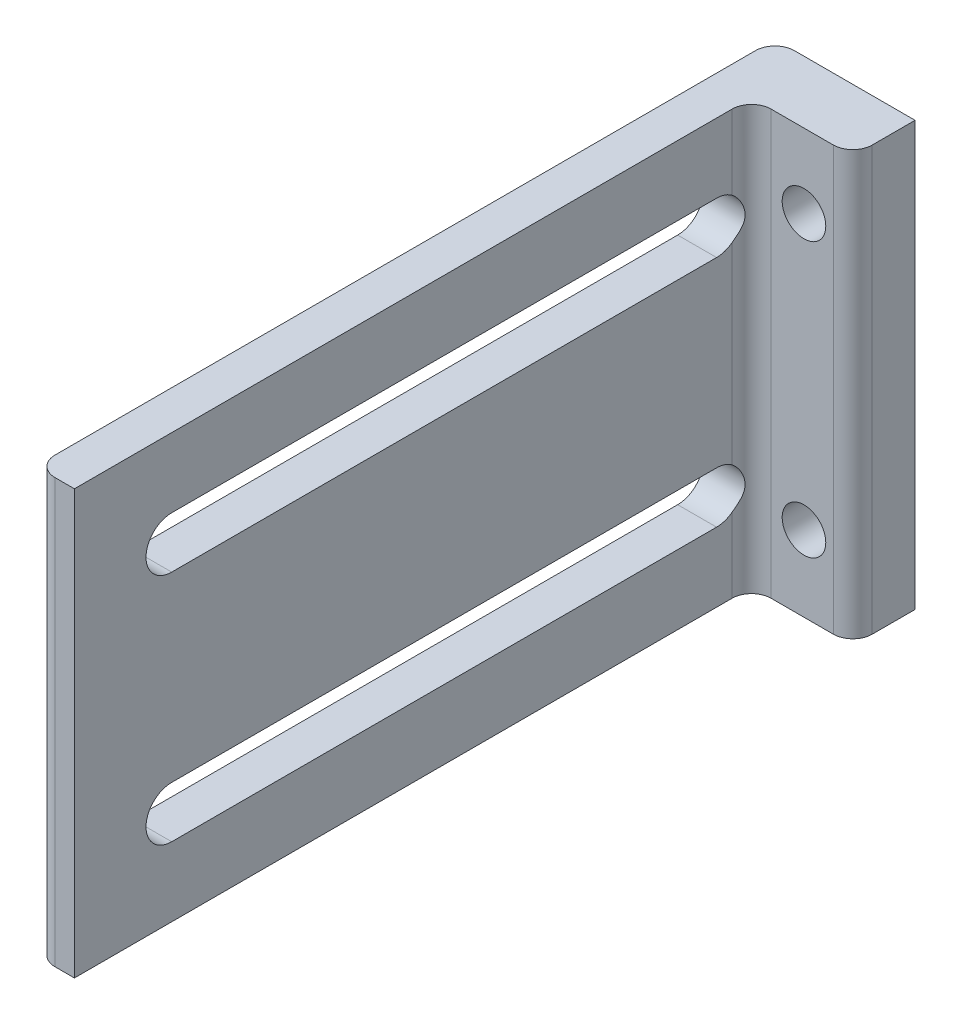
ISO-10303-21;
HEADER;
FILE_DESCRIPTION(('STEP AP214'),'2;1');
FILE_NAME('part.step','',(''),(''),'','','');
FILE_SCHEMA(('AUTOMOTIVE_DESIGN { 1 0 10303 214 1 1 1 1 }'));
ENDSEC;
DATA;
#1=APPLICATION_CONTEXT('core data for automotive mechanical design processes');
#2=APPLICATION_PROTOCOL_DEFINITION('international standard','automotive_design',2000,#1);
#3=PRODUCT_CONTEXT('',#1,'mechanical');
#4=PRODUCT('Part','Part','',(#3));
#5=PRODUCT_RELATED_PRODUCT_CATEGORY('part','',(#4));
#6=PRODUCT_DEFINITION_FORMATION('','',#4);
#7=PRODUCT_DEFINITION_CONTEXT('part definition',#1,'design');
#8=PRODUCT_DEFINITION('design','',#6,#7);
#9=PRODUCT_DEFINITION_SHAPE('','',#8);
#10=(LENGTH_UNIT() NAMED_UNIT(*) SI_UNIT(.MILLI.,.METRE.));
#11=(NAMED_UNIT(*) PLANE_ANGLE_UNIT() SI_UNIT($,.RADIAN.));
#12=(NAMED_UNIT(*) SI_UNIT($,.STERADIAN.) SOLID_ANGLE_UNIT());
#13=UNCERTAINTY_MEASURE_WITH_UNIT(LENGTH_MEASURE(1.E-05),#10,'distance_accuracy_value','');
#14=(GEOMETRIC_REPRESENTATION_CONTEXT(3) GLOBAL_UNCERTAINTY_ASSIGNED_CONTEXT((#13)) GLOBAL_UNIT_ASSIGNED_CONTEXT((#10,
#11,#12)) REPRESENTATION_CONTEXT('',''));
#15=CARTESIAN_POINT('',(0.,0.,0.));
#16=DIRECTION('',(0.,0.,1.));
#17=DIRECTION('',(1.,0.,0.));
#18=AXIS2_PLACEMENT_3D('',#15,#16,#17);
#19=CARTESIAN_POINT('',(-44.365,-28.1052986336546,4.));
#20=DIRECTION('',(-1.,0.,0.));
#21=DIRECTION('',(0.,-1.,0.));
#22=AXIS2_PLACEMENT_3D('',#19,#20,#21);
#23=PLANE('',#22);
#24=DIRECTION('',(0.,0.,-1.));
#25=VECTOR('',#24,1.);
#26=CARTESIAN_POINT('',(-44.365,-0.889999999999988,4.));
#27=LINE('',#26,#25);
#28=CARTESIAN_POINT('',(-44.365,-0.889999999999988,2.75));
#29=VERTEX_POINT('',#28);
#30=CARTESIAN_POINT('',(-44.365,-0.889999999999988,0.));
#31=VERTEX_POINT('',#30);
#32=EDGE_CURVE('E355',#29,#31,#27,.T.);
#33=ORIENTED_EDGE('',*,*,#32,.F.);
#34=DIRECTION('',(0.,1.,0.));
#35=VECTOR('',#34,1.);
#36=CARTESIAN_POINT('',(-44.365,-28.1052986336546,2.75));
#37=LINE('',#36,#35);
#38=CARTESIAN_POINT('',(-44.365,-28.1052986336546,2.75));
#39=VERTEX_POINT('',#38);
#40=EDGE_CURVE('E278',#29,#39,#37,.F.);
#41=ORIENTED_EDGE('',*,*,#40,.T.);
#42=DIRECTION('',(0.,0.,-1.));
#43=VECTOR('',#42,1.);
#44=CARTESIAN_POINT('',(-44.365,-28.1052986336546,4.));
#45=LINE('',#44,#43);
#46=CARTESIAN_POINT('',(-44.365,-28.1052986336546,0.));
#47=VERTEX_POINT('',#46);
#48=EDGE_CURVE('E344',#39,#47,#45,.T.);
#49=ORIENTED_EDGE('',*,*,#48,.T.);
#50=DIRECTION('',(0.,1.,0.));
#51=VECTOR('',#50,1.);
#52=CARTESIAN_POINT('',(-44.365,-28.1052986336546,0.));
#53=LINE('',#52,#51);
#54=EDGE_CURVE('E335',#47,#31,#53,.T.);
#55=ORIENTED_EDGE('',*,*,#54,.T.);
#56=EDGE_LOOP('',(#33,#41,#49,#55));
#57=FACE_BOUND('',#56,.T.);
#58=ADVANCED_FACE('F33',(#57),#23,.F.);
#59=CARTESIAN_POINT('',(-44.365,-0.889999999999988,4.));
#60=DIRECTION('',(0.,-1.,0.));
#61=DIRECTION('',(1.,0.,0.));
#62=AXIS2_PLACEMENT_3D('',#59,#60,#61);
#63=PLANE('',#62);
#64=DIRECTION('',(-1.,0.,0.));
#65=VECTOR('',#64,1.);
#66=CARTESIAN_POINT('',(-44.365,-0.889999999999988,0.));
#67=LINE('',#66,#65);
#68=CARTESIAN_POINT('',(-52.115,-0.889999999999989,0.));
#69=VERTEX_POINT('',#68);
#70=EDGE_CURVE('E338',#31,#69,#67,.T.);
#71=ORIENTED_EDGE('',*,*,#70,.T.);
#72=CARTESIAN_POINT('',(-52.115,-0.889999999999988,1.25));
#73=DIRECTION('',(0.,-1.,0.));
#74=DIRECTION('',(1.,0.,0.));
#75=AXIS2_PLACEMENT_3D('',#72,#73,#74);
#76=CIRCLE('',#75,1.25);
#77=CARTESIAN_POINT('',(-53.365,-0.889999999999989,1.25));
#78=VERTEX_POINT('',#77);
#79=EDGE_CURVE('E299',#69,#78,#76,.F.);
#80=ORIENTED_EDGE('',*,*,#79,.T.);
#81=DIRECTION('',(0.,0.,-1.));
#82=VECTOR('',#81,1.);
#83=CARTESIAN_POINT('',(-53.365,-0.889999999999989,4.));
#84=LINE('',#83,#82);
#85=CARTESIAN_POINT('',(-53.365,-0.889999999999989,46.25));
#86=VERTEX_POINT('',#85);
#87=EDGE_CURVE('E352',#86,#78,#84,.T.);
#88=ORIENTED_EDGE('',*,*,#87,.F.);
#89=CARTESIAN_POINT('',(-52.115,-0.889999999999989,46.25));
#90=DIRECTION('',(0.,-1.,0.));
#91=DIRECTION('',(1.,0.,0.));
#92=AXIS2_PLACEMENT_3D('',#89,#90,#91);
#93=CIRCLE('',#92,1.25);
#94=CARTESIAN_POINT('',(-52.115,-0.889999999999988,47.5));
#95=VERTEX_POINT('',#94);
#96=EDGE_CURVE('E295',#86,#95,#93,.F.);
#97=ORIENTED_EDGE('',*,*,#96,.T.);
#98=DIRECTION('',(-1.,0.,0.));
#99=VECTOR('',#98,1.);
#100=CARTESIAN_POINT('',(-53.365,-0.889999999999988,47.5));
#101=LINE('',#100,#99);
#102=CARTESIAN_POINT('',(-50.865,-0.889999999999988,47.5));
#103=VERTEX_POINT('',#102);
#104=EDGE_CURVE('E340',#103,#95,#101,.T.);
#105=ORIENTED_EDGE('',*,*,#104,.F.);
#106=DIRECTION('',(0.,0.,-1.));
#107=VECTOR('',#106,1.);
#108=CARTESIAN_POINT('',(-50.865,-0.889999999999988,47.5));
#109=LINE('',#108,#107);
#110=CARTESIAN_POINT('',(-50.865,-0.889999999999988,5.25));
#111=VERTEX_POINT('',#110);
#112=EDGE_CURVE('E318',#103,#111,#109,.T.);
#113=ORIENTED_EDGE('',*,*,#112,.T.);
#114=CARTESIAN_POINT('',(-49.615,-0.889999999999988,5.25));
#115=DIRECTION('',(0.,-1.,0.));
#116=DIRECTION('',(1.,0.,0.));
#117=AXIS2_PLACEMENT_3D('',#114,#115,#116);
#118=CIRCLE('',#117,1.25);
#119=CARTESIAN_POINT('',(-49.615,-0.889999999999989,4.));
#120=VERTEX_POINT('',#119);
#121=EDGE_CURVE('E41',#111,#120,#118,.T.);
#122=ORIENTED_EDGE('',*,*,#121,.T.);
#123=DIRECTION('',(-1.,0.,0.));
#124=VECTOR('',#123,1.);
#125=CARTESIAN_POINT('',(-44.365,-0.889999999999988,4.));
#126=LINE('',#125,#124);
#127=CARTESIAN_POINT('',(-45.615,-0.889999999999988,4.));
#128=VERTEX_POINT('',#127);
#129=EDGE_CURVE('E315',#128,#120,#126,.T.);
#130=ORIENTED_EDGE('',*,*,#129,.F.);
#131=CARTESIAN_POINT('',(-45.615,-0.889999999999988,2.75));
#132=DIRECTION('',(0.,-1.,0.));
#133=DIRECTION('',(1.,0.,0.));
#134=AXIS2_PLACEMENT_3D('',#131,#132,#133);
#135=CIRCLE('',#134,1.25);
#136=EDGE_CURVE('E297',#128,#29,#135,.F.);
#137=ORIENTED_EDGE('',*,*,#136,.T.);
#138=ORIENTED_EDGE('',*,*,#32,.T.);
#139=EDGE_LOOP('',(#71,#80,#88,#97,#105,#113,#122,#130,#137,#138));
#140=FACE_BOUND('',#139,.T.);
#141=ADVANCED_FACE('F246',(#140),#63,.F.);
#142=CARTESIAN_POINT('',(-53.365,-28.1052986336546,4.));
#143=DIRECTION('',(1.,0.,0.));
#144=DIRECTION('',(0.,1.,0.));
#145=AXIS2_PLACEMENT_3D('',#142,#143,#144);
#146=PLANE('',#145);
#147=DIRECTION('',(0.,0.,1.));
#148=VECTOR('',#147,1.);
#149=CARTESIAN_POINT('',(-53.365,-23.65,6.25));
#150=LINE('',#149,#148);
#151=CARTESIAN_POINT('',(-53.365,-23.65,6.25));
#152=VERTEX_POINT('',#151);
#153=CARTESIAN_POINT('',(-53.365,-23.65,41.25));
#154=VERTEX_POINT('',#153);
#155=EDGE_CURVE('E203',#152,#154,#150,.T.);
#156=ORIENTED_EDGE('',*,*,#155,.F.);
#157=CARTESIAN_POINT('',(-53.365,-22.,6.25));
#158=DIRECTION('',(-1.,0.,0.));
#159=DIRECTION('',(0.,-1.,0.));
#160=AXIS2_PLACEMENT_3D('',#157,#158,#159);
#161=CIRCLE('',#160,1.65);
#162=CARTESIAN_POINT('',(-53.365,-20.35,6.25));
#163=VERTEX_POINT('',#162);
#164=EDGE_CURVE('E48',#163,#152,#161,.T.);
#165=ORIENTED_EDGE('',*,*,#164,.F.);
#166=DIRECTION('',(0.,0.,-1.));
#167=VECTOR('',#166,1.);
#168=CARTESIAN_POINT('',(-53.365,-20.35,6.25));
#169=LINE('',#168,#167);
#170=CARTESIAN_POINT('',(-53.365,-20.35,41.25));
#171=VERTEX_POINT('',#170);
#172=EDGE_CURVE('E177',#171,#163,#169,.T.);
#173=ORIENTED_EDGE('',*,*,#172,.F.);
#174=CARTESIAN_POINT('',(-53.365,-22.,41.25));
#175=DIRECTION('',(-1.,0.,0.));
#176=DIRECTION('',(0.,-1.,0.));
#177=AXIS2_PLACEMENT_3D('',#174,#175,#176);
#178=CIRCLE('',#177,1.65);
#179=EDGE_CURVE('E205',#154,#171,#178,.T.);
#180=ORIENTED_EDGE('',*,*,#179,.F.);
#181=EDGE_LOOP('',(#156,#165,#173,#180));
#182=FACE_BOUND('',#181,.T.);
#183=DIRECTION('',(0.,0.,1.));
#184=VECTOR('',#183,1.);
#185=CARTESIAN_POINT('',(-53.365,-8.64999999999999,6.25));
#186=LINE('',#185,#184);
#187=CARTESIAN_POINT('',(-53.365,-8.64999999999999,6.25));
#188=VERTEX_POINT('',#187);
#189=CARTESIAN_POINT('',(-53.365,-8.64999999999999,41.25));
#190=VERTEX_POINT('',#189);
#191=EDGE_CURVE('E421',#188,#190,#186,.T.);
#192=ORIENTED_EDGE('',*,*,#191,.F.);
#193=CARTESIAN_POINT('',(-53.365,-6.99999999999999,6.25));
#194=DIRECTION('',(-1.,0.,0.));
#195=DIRECTION('',(0.,-1.,0.));
#196=AXIS2_PLACEMENT_3D('',#193,#194,#195);
#197=CIRCLE('',#196,1.65);
#198=CARTESIAN_POINT('',(-53.365,-5.34999999999999,6.25));
#199=VERTEX_POINT('',#198);
#200=EDGE_CURVE('E56',#199,#188,#197,.T.);
#201=ORIENTED_EDGE('',*,*,#200,.F.);
#202=DIRECTION('',(0.,0.,-1.));
#203=VECTOR('',#202,1.);
#204=CARTESIAN_POINT('',(-53.365,-5.34999999999999,6.25));
#205=LINE('',#204,#203);
#206=CARTESIAN_POINT('',(-53.365,-5.34999999999999,41.25));
#207=VERTEX_POINT('',#206);
#208=EDGE_CURVE('E426',#207,#199,#205,.T.);
#209=ORIENTED_EDGE('',*,*,#208,.F.);
#210=CARTESIAN_POINT('',(-53.365,-6.99999999999999,41.25));
#211=DIRECTION('',(-1.,0.,0.));
#212=DIRECTION('',(0.,-1.,0.));
#213=AXIS2_PLACEMENT_3D('',#210,#211,#212);
#214=CIRCLE('',#213,1.65);
#215=EDGE_CURVE('E423',#190,#207,#214,.T.);
#216=ORIENTED_EDGE('',*,*,#215,.F.);
#217=EDGE_LOOP('',(#192,#201,#209,#216));
#218=FACE_BOUND('',#217,.T.);
#219=ORIENTED_EDGE('',*,*,#87,.T.);
#220=DIRECTION('',(0.,-1.,0.));
#221=VECTOR('',#220,1.);
#222=CARTESIAN_POINT('',(-53.365,-28.1052986336546,1.25));
#223=LINE('',#222,#221);
#224=CARTESIAN_POINT('',(-53.365,-28.1052986336546,1.25));
#225=VERTEX_POINT('',#224);
#226=EDGE_CURVE('E290',#78,#225,#223,.T.);
#227=ORIENTED_EDGE('',*,*,#226,.T.);
#228=DIRECTION('',(0.,0.,-1.));
#229=VECTOR('',#228,1.);
#230=CARTESIAN_POINT('',(-53.365,-28.1052986336546,4.));
#231=LINE('',#230,#229);
#232=CARTESIAN_POINT('',(-53.365,-28.1052986336546,46.25));
#233=VERTEX_POINT('',#232);
#234=EDGE_CURVE('E350',#233,#225,#231,.T.);
#235=ORIENTED_EDGE('',*,*,#234,.F.);
#236=DIRECTION('',(0.,-1.,0.));
#237=VECTOR('',#236,1.);
#238=CARTESIAN_POINT('',(-53.365,-28.1052986336546,46.25));
#239=LINE('',#238,#237);
#240=EDGE_CURVE('E357',#233,#86,#239,.F.);
#241=ORIENTED_EDGE('',*,*,#240,.T.);
#242=EDGE_LOOP('',(#219,#227,#235,#241));
#243=FACE_BOUND('',#242,.T.);
#244=ADVANCED_FACE('F252',(#182,#218,#243),#146,.F.);
#245=CARTESIAN_POINT('',(-44.365,-28.1052986336546,4.));
#246=DIRECTION('',(0.,1.,0.));
#247=DIRECTION('',(0.,0.,1.));
#248=AXIS2_PLACEMENT_3D('',#245,#246,#247);
#249=PLANE('',#248);
#250=ORIENTED_EDGE('',*,*,#234,.T.);
#251=CARTESIAN_POINT('',(-52.115,-28.1052986336546,1.25));
#252=DIRECTION('',(0.,1.,0.));
#253=DIRECTION('',(0.,0.,1.));
#254=AXIS2_PLACEMENT_3D('',#251,#252,#253);
#255=CIRCLE('',#254,1.25);
#256=CARTESIAN_POINT('',(-52.115,-28.1052986336546,0.));
#257=VERTEX_POINT('',#256);
#258=EDGE_CURVE('E285',#225,#257,#255,.F.);
#259=ORIENTED_EDGE('',*,*,#258,.T.);
#260=DIRECTION('',(1.,0.,0.));
#261=VECTOR('',#260,1.);
#262=CARTESIAN_POINT('',(-44.365,-28.1052986336546,0.));
#263=LINE('',#262,#261);
#264=EDGE_CURVE('E324',#257,#47,#263,.T.);
#265=ORIENTED_EDGE('',*,*,#264,.T.);
#266=ORIENTED_EDGE('',*,*,#48,.F.);
#267=CARTESIAN_POINT('',(-45.615,-28.1052986336546,2.75));
#268=DIRECTION('',(0.,1.,0.));
#269=DIRECTION('',(0.,0.,1.));
#270=AXIS2_PLACEMENT_3D('',#267,#268,#269);
#271=CIRCLE('',#270,1.25);
#272=CARTESIAN_POINT('',(-45.615,-28.1052986336546,4.));
#273=VERTEX_POINT('',#272);
#274=EDGE_CURVE('E277',#39,#273,#271,.F.);
#275=ORIENTED_EDGE('',*,*,#274,.T.);
#276=DIRECTION('',(1.,0.,0.));
#277=VECTOR('',#276,1.);
#278=CARTESIAN_POINT('',(-44.365,-28.1052986336546,4.));
#279=LINE('',#278,#277);
#280=CARTESIAN_POINT('',(-49.615,-28.1052986336546,4.));
#281=VERTEX_POINT('',#280);
#282=EDGE_CURVE('E323',#281,#273,#279,.T.);
#283=ORIENTED_EDGE('',*,*,#282,.F.);
#284=CARTESIAN_POINT('',(-49.615,-28.1052986336546,5.25));
#285=DIRECTION('',(0.,1.,0.));
#286=DIRECTION('',(0.,0.,1.));
#287=AXIS2_PLACEMENT_3D('',#284,#285,#286);
#288=CIRCLE('',#287,1.25);
#289=CARTESIAN_POINT('',(-50.865,-28.1052986336546,5.25));
#290=VERTEX_POINT('',#289);
#291=EDGE_CURVE('E11',#281,#290,#288,.T.);
#292=ORIENTED_EDGE('',*,*,#291,.T.);
#293=DIRECTION('',(0.,0.,-1.));
#294=VECTOR('',#293,1.);
#295=CARTESIAN_POINT('',(-50.865,-28.1052986336546,47.5));
#296=LINE('',#295,#294);
#297=CARTESIAN_POINT('',(-50.865,-28.1052986336546,47.5));
#298=VERTEX_POINT('',#297);
#299=EDGE_CURVE('E332',#298,#290,#296,.T.);
#300=ORIENTED_EDGE('',*,*,#299,.F.);
#301=DIRECTION('',(1.,0.,0.));
#302=VECTOR('',#301,1.);
#303=CARTESIAN_POINT('',(-53.365,-28.1052986336546,47.5));
#304=LINE('',#303,#302);
#305=CARTESIAN_POINT('',(-52.115,-28.1052986336546,47.5));
#306=VERTEX_POINT('',#305);
#307=EDGE_CURVE('E221',#306,#298,#304,.T.);
#308=ORIENTED_EDGE('',*,*,#307,.F.);
#309=CARTESIAN_POINT('',(-52.115,-28.1052986336546,46.25));
#310=DIRECTION('',(0.,1.,0.));
#311=DIRECTION('',(0.,0.,1.));
#312=AXIS2_PLACEMENT_3D('',#309,#310,#311);
#313=CIRCLE('',#312,1.25);
#314=EDGE_CURVE('E286',#306,#233,#313,.F.);
#315=ORIENTED_EDGE('',*,*,#314,.T.);
#316=EDGE_LOOP('',(#250,#259,#265,#266,#275,#283,#292,#300,#308,#315));
#317=FACE_BOUND('',#316,.T.);
#318=ADVANCED_FACE('F330',(#317),#249,.F.);
#319=CARTESIAN_POINT('',(0.,0.,4.));
#320=DIRECTION('',(0.,0.,1.));
#321=DIRECTION('',(1.,0.,0.));
#322=AXIS2_PLACEMENT_3D('',#319,#320,#321);
#323=PLANE('',#322);
#324=CARTESIAN_POINT('',(-47.5,-23.25,4.));
#325=DIRECTION('',(0.,0.,1.));
#326=DIRECTION('',(1.,0.,0.));
#327=AXIS2_PLACEMENT_3D('',#324,#325,#326);
#328=CIRCLE('',#327,1.4);
#329=CARTESIAN_POINT('',(-46.1,-23.25,4.));
#330=VERTEX_POINT('',#329);
#331=EDGE_CURVE('E439',#330,#330,#328,.T.);
#332=ORIENTED_EDGE('',*,*,#331,.F.);
#333=EDGE_LOOP('',(#332));
#334=FACE_BOUND('',#333,.T.);
#335=CARTESIAN_POINT('',(-47.5,-5.65,4.));
#336=DIRECTION('',(0.,0.,1.));
#337=DIRECTION('',(1.,0.,0.));
#338=AXIS2_PLACEMENT_3D('',#335,#336,#337);
#339=CIRCLE('',#338,1.4);
#340=CARTESIAN_POINT('',(-46.1,-5.65,4.));
#341=VERTEX_POINT('',#340);
#342=EDGE_CURVE('E449',#341,#341,#339,.T.);
#343=ORIENTED_EDGE('',*,*,#342,.F.);
#344=EDGE_LOOP('',(#343));
#345=FACE_BOUND('',#344,.T.);
#346=ORIENTED_EDGE('',*,*,#129,.T.);
#347=DIRECTION('',(0.,1.,0.));
#348=VECTOR('',#347,1.);
#349=CARTESIAN_POINT('',(-49.615,0.,4.));
#350=LINE('',#349,#348);
#351=EDGE_CURVE('E305',#120,#281,#350,.F.);
#352=ORIENTED_EDGE('',*,*,#351,.T.);
#353=ORIENTED_EDGE('',*,*,#282,.T.);
#354=DIRECTION('',(0.,1.,0.));
#355=VECTOR('',#354,1.);
#356=CARTESIAN_POINT('',(-45.615,-0.889999999999989,4.));
#357=LINE('',#356,#355);
#358=EDGE_CURVE('E280',#273,#128,#357,.T.);
#359=ORIENTED_EDGE('',*,*,#358,.T.);
#360=EDGE_LOOP('',(#346,#352,#353,#359));
#361=FACE_BOUND('',#360,.T.);
#362=ADVANCED_FACE('F322',(#334,#345,#361),#323,.T.);
#363=CARTESIAN_POINT('',(0.,0.,0.));
#364=DIRECTION('',(0.,0.,1.));
#365=DIRECTION('',(1.,0.,0.));
#366=AXIS2_PLACEMENT_3D('',#363,#364,#365);
#367=PLANE('',#366);
#368=CARTESIAN_POINT('',(-47.5,-23.25,0.));
#369=DIRECTION('',(0.,0.,1.));
#370=DIRECTION('',(1.,0.,0.));
#371=AXIS2_PLACEMENT_3D('',#368,#369,#370);
#372=CIRCLE('',#371,1.4);
#373=CARTESIAN_POINT('',(-46.1,-23.25,0.));
#374=VERTEX_POINT('',#373);
#375=EDGE_CURVE('E437',#374,#374,#372,.T.);
#376=ORIENTED_EDGE('',*,*,#375,.T.);
#377=EDGE_LOOP('',(#376));
#378=FACE_BOUND('',#377,.T.);
#379=CARTESIAN_POINT('',(-47.5,-5.65,0.));
#380=DIRECTION('',(0.,0.,1.));
#381=DIRECTION('',(1.,0.,0.));
#382=AXIS2_PLACEMENT_3D('',#379,#380,#381);
#383=CIRCLE('',#382,1.4);
#384=CARTESIAN_POINT('',(-46.1,-5.65,0.));
#385=VERTEX_POINT('',#384);
#386=EDGE_CURVE('E444',#385,#385,#383,.T.);
#387=ORIENTED_EDGE('',*,*,#386,.T.);
#388=EDGE_LOOP('',(#387));
#389=FACE_BOUND('',#388,.T.);
#390=ORIENTED_EDGE('',*,*,#264,.F.);
#391=DIRECTION('',(0.,-1.,0.));
#392=VECTOR('',#391,1.);
#393=CARTESIAN_POINT('',(-52.115,0.,0.));
#394=LINE('',#393,#392);
#395=EDGE_CURVE('E288',#257,#69,#394,.F.);
#396=ORIENTED_EDGE('',*,*,#395,.T.);
#397=ORIENTED_EDGE('',*,*,#70,.F.);
#398=ORIENTED_EDGE('',*,*,#54,.F.);
#399=EDGE_LOOP('',(#390,#396,#397,#398));
#400=FACE_BOUND('',#399,.T.);
#401=ADVANCED_FACE('F502',(#378,#389,#400),#367,.F.);
#402=CARTESIAN_POINT('',(-50.865,-28.1052986336546,47.5));
#403=DIRECTION('',(-1.,0.,0.));
#404=DIRECTION('',(0.,0.,1.));
#405=AXIS2_PLACEMENT_3D('',#402,#403,#404);
#406=PLANE('',#405);
#407=DIRECTION('',(0.,0.,1.));
#408=VECTOR('',#407,1.);
#409=CARTESIAN_POINT('',(-50.865,-20.35,6.25));
#410=LINE('',#409,#408);
#411=CARTESIAN_POINT('',(-50.865,-20.35,6.25));
#412=VERTEX_POINT('',#411);
#413=CARTESIAN_POINT('',(-50.865,-20.35,41.25));
#414=VERTEX_POINT('',#413);
#415=EDGE_CURVE('E195',#412,#414,#410,.T.);
#416=ORIENTED_EDGE('',*,*,#415,.F.);
#417=CARTESIAN_POINT('',(-50.865,-22.,6.25));
#418=DIRECTION('',(-1.,0.,0.));
#419=DIRECTION('',(0.,0.,1.));
#420=AXIS2_PLACEMENT_3D('',#417,#418,#419);
#421=CIRCLE('',#420,1.65);
#422=CARTESIAN_POINT('',(-50.865,-20.6875595251593,5.25));
#423=VERTEX_POINT('',#422);
#424=EDGE_CURVE('E194',#423,#412,#421,.F.);
#425=ORIENTED_EDGE('',*,*,#424,.F.);
#426=DIRECTION('',(0.,1.,0.));
#427=VECTOR('',#426,1.);
#428=CARTESIAN_POINT('',(-50.865,-28.1052986336546,5.25));
#429=LINE('',#428,#427);
#430=CARTESIAN_POINT('',(-50.865,-8.31244047484066,5.25));
#431=VERTEX_POINT('',#430);
#432=EDGE_CURVE('E303',#423,#431,#429,.T.);
#433=ORIENTED_EDGE('',*,*,#432,.T.);
#434=CARTESIAN_POINT('',(-50.865,-6.99999999999999,6.25));
#435=DIRECTION('',(-1.,0.,0.));
#436=DIRECTION('',(0.,0.,1.));
#437=AXIS2_PLACEMENT_3D('',#434,#435,#436);
#438=CIRCLE('',#437,1.65);
#439=CARTESIAN_POINT('',(-50.865,-8.64999999999999,6.25));
#440=VERTEX_POINT('',#439);
#441=EDGE_CURVE('E411',#440,#431,#438,.F.);
#442=ORIENTED_EDGE('',*,*,#441,.F.);
#443=DIRECTION('',(0.,0.,-1.));
#444=VECTOR('',#443,1.);
#445=CARTESIAN_POINT('',(-50.865,-8.64999999999999,6.25));
#446=LINE('',#445,#444);
#447=CARTESIAN_POINT('',(-50.865,-8.64999999999999,41.25));
#448=VERTEX_POINT('',#447);
#449=EDGE_CURVE('E380',#448,#440,#446,.T.);
#450=ORIENTED_EDGE('',*,*,#449,.F.);
#451=CARTESIAN_POINT('',(-50.865,-6.99999999999999,41.25));
#452=DIRECTION('',(-1.,0.,0.));
#453=DIRECTION('',(0.,0.,1.));
#454=AXIS2_PLACEMENT_3D('',#451,#452,#453);
#455=CIRCLE('',#454,1.65);
#456=CARTESIAN_POINT('',(-50.865,-5.34999999999999,41.25));
#457=VERTEX_POINT('',#456);
#458=EDGE_CURVE('E222',#457,#448,#455,.F.);
#459=ORIENTED_EDGE('',*,*,#458,.F.);
#460=DIRECTION('',(0.,0.,1.));
#461=VECTOR('',#460,1.);
#462=CARTESIAN_POINT('',(-50.865,-5.34999999999999,6.25));
#463=LINE('',#462,#461);
#464=CARTESIAN_POINT('',(-50.865,-5.34999999999999,6.25));
#465=VERTEX_POINT('',#464);
#466=EDGE_CURVE('E415',#465,#457,#463,.T.);
#467=ORIENTED_EDGE('',*,*,#466,.F.);
#468=CARTESIAN_POINT('',(-50.865,-5.68755952515932,5.25));
#469=VERTEX_POINT('',#468);
#470=EDGE_CURVE('E414',#469,#465,#438,.F.);
#471=ORIENTED_EDGE('',*,*,#470,.F.);
#472=EDGE_CURVE('E301',#469,#111,#429,.T.);
#473=ORIENTED_EDGE('',*,*,#472,.T.);
#474=ORIENTED_EDGE('',*,*,#112,.F.);
#475=DIRECTION('',(0.,1.,0.));
#476=VECTOR('',#475,1.);
#477=CARTESIAN_POINT('',(-50.865,-28.1052986336546,47.5));
#478=LINE('',#477,#476);
#479=EDGE_CURVE('E334',#298,#103,#478,.T.);
#480=ORIENTED_EDGE('',*,*,#479,.F.);
#481=ORIENTED_EDGE('',*,*,#299,.T.);
#482=CARTESIAN_POINT('',(-50.865,-23.3124404748407,5.25));
#483=VERTEX_POINT('',#482);
#484=EDGE_CURVE('E193',#290,#483,#429,.T.);
#485=ORIENTED_EDGE('',*,*,#484,.T.);
#486=CARTESIAN_POINT('',(-50.865,-23.65,6.25));
#487=VERTEX_POINT('',#486);
#488=EDGE_CURVE('E171',#487,#483,#421,.F.);
#489=ORIENTED_EDGE('',*,*,#488,.F.);
#490=DIRECTION('',(0.,0.,-1.));
#491=VECTOR('',#490,1.);
#492=CARTESIAN_POINT('',(-50.865,-23.65,6.25));
#493=LINE('',#492,#491);
#494=CARTESIAN_POINT('',(-50.865,-23.65,41.25));
#495=VERTEX_POINT('',#494);
#496=EDGE_CURVE('E180',#495,#487,#493,.T.);
#497=ORIENTED_EDGE('',*,*,#496,.F.);
#498=CARTESIAN_POINT('',(-50.865,-22.,41.25));
#499=DIRECTION('',(-1.,0.,0.));
#500=DIRECTION('',(0.,0.,1.));
#501=AXIS2_PLACEMENT_3D('',#498,#499,#500);
#502=CIRCLE('',#501,1.65);
#503=EDGE_CURVE('E198',#414,#495,#502,.F.);
#504=ORIENTED_EDGE('',*,*,#503,.F.);
#505=EDGE_LOOP('',(#416,#425,#433,#442,#450,#459,#467,#471,#473,#474,#480,#481,#485,#489,#497,#504));
#506=FACE_BOUND('',#505,.T.);
#507=ADVANCED_FACE('F190',(#506),#406,.F.);
#508=CARTESIAN_POINT('',(0.,0.,47.5));
#509=DIRECTION('',(0.,0.,-1.));
#510=DIRECTION('',(-1.,0.,0.));
#511=AXIS2_PLACEMENT_3D('',#508,#509,#510);
#512=PLANE('',#511);
#513=ORIENTED_EDGE('',*,*,#104,.T.);
#514=DIRECTION('',(0.,-1.,0.));
#515=VECTOR('',#514,1.);
#516=CARTESIAN_POINT('',(-52.115,0.,47.5));
#517=LINE('',#516,#515);
#518=EDGE_CURVE('E308',#95,#306,#517,.T.);
#519=ORIENTED_EDGE('',*,*,#518,.T.);
#520=ORIENTED_EDGE('',*,*,#307,.T.);
#521=ORIENTED_EDGE('',*,*,#479,.T.);
#522=EDGE_LOOP('',(#513,#519,#520,#521));
#523=FACE_BOUND('',#522,.T.);
#524=ADVANCED_FACE('F262',(#523),#512,.F.);
#525=CARTESIAN_POINT('',(-52.115,-28.1052986336546,1.25));
#526=DIRECTION('',(0.,-1.,0.));
#527=DIRECTION('',(1.,0.,0.));
#528=AXIS2_PLACEMENT_3D('',#525,#526,#527);
#529=CYLINDRICAL_SURFACE('',#528,1.25);
#530=ORIENTED_EDGE('',*,*,#79,.F.);
#531=ORIENTED_EDGE('',*,*,#395,.F.);
#532=ORIENTED_EDGE('',*,*,#258,.F.);
#533=ORIENTED_EDGE('',*,*,#226,.F.);
#534=EDGE_LOOP('',(#530,#531,#532,#533));
#535=FACE_BOUND('',#534,.T.);
#536=ADVANCED_FACE('F258',(#535),#529,.T.);
#537=CARTESIAN_POINT('',(-49.615,-28.1052986336546,5.25));
#538=DIRECTION('',(0.,1.,0.));
#539=DIRECTION('',(0.,0.,1.));
#540=AXIS2_PLACEMENT_3D('',#537,#538,#539);
#541=CYLINDRICAL_SURFACE('',#540,1.25);
#542=ORIENTED_EDGE('',*,*,#432,.F.);
#543=CARTESIAN_POINT('',(-50.865,-23.3124404748407,5.25));
#544=CARTESIAN_POINT('',(-50.8649992717028,-23.2866166520816,5.21610024245661));
#545=CARTESIAN_POINT('',(-50.8636215242198,-23.2595011350232,5.18324472113669));
#546=CARTESIAN_POINT('',(-50.8586129687445,-23.2029482363296,5.11986131070612));
#547=CARTESIAN_POINT('',(-50.8549854839142,-23.1735143351394,5.08933006288272));
#548=CARTESIAN_POINT('',(-50.8415220105058,-23.0823547596228,5.00176993014581));
#549=CARTESIAN_POINT('',(-50.8290935124888,-23.017471205245,4.94838345139386));
#550=CARTESIAN_POINT('',(-50.8011849679758,-22.8812543688219,4.85257204709283));
#551=CARTESIAN_POINT('',(-50.7857199766035,-22.8099538110866,4.81009533640023));
#552=CARTESIAN_POINT('',(-50.75520754385,-22.661589143107,4.73616781322622));
#553=CARTESIAN_POINT('',(-50.7401609924792,-22.5845138704241,4.70473906009063));
#554=CARTESIAN_POINT('',(-50.7122428599126,-22.4151440688543,4.65029691687732));
#555=CARTESIAN_POINT('',(-50.6999292121378,-22.3221909152463,4.62896551153259));
#556=CARTESIAN_POINT('',(-50.6882936772714,-22.1806774273722,4.60922854610828));
#557=CARTESIAN_POINT('',(-50.685553965897,-22.1331847308304,4.6046920758034));
#558=CARTESIAN_POINT('',(-50.6825573576807,-22.0379101314621,4.5997462803572));
#559=CARTESIAN_POINT('',(-50.6823000448221,-21.9901282784374,4.59933626367692));
#560=CARTESIAN_POINT('',(-50.6850922882418,-21.8593928206062,4.60390909102355));
#561=CARTESIAN_POINT('',(-50.6907321416394,-21.7765997404492,4.6131109344388));
#562=CARTESIAN_POINT('',(-50.7082267017702,-21.6139184731034,4.64366041784623));
#563=CARTESIAN_POINT('',(-50.7200927708462,-21.5340358833028,4.6650302695682));
#564=CARTESIAN_POINT('',(-50.7472693928914,-21.3778358609235,4.71952785102812));
#565=CARTESIAN_POINT('',(-50.7626233521666,-21.3015794192363,4.7528070850908));
#566=CARTESIAN_POINT('',(-50.7931914515133,-21.155022873153,4.83035841285723));
#567=CARTESIAN_POINT('',(-50.8084057836097,-21.0847129473514,4.87461188620883));
#568=CARTESIAN_POINT('',(-50.8341267074735,-20.956136062493,4.96987098156734));
#569=CARTESIAN_POINT('',(-50.8449034036969,-20.897359838583,5.02010673865809));
#570=CARTESIAN_POINT('',(-50.8603451103374,-20.786787006209,5.12897330428698));
#571=CARTESIAN_POINT('',(-50.8649822987152,-20.7350231186641,5.18764100276552));
#572=CARTESIAN_POINT('',(-50.865,-20.6875595251593,5.25));
#573=B_SPLINE_CURVE_WITH_KNOTS('',3,(#543,#544,#545,#546,#547,#548,#549,#550,#551,#552,#553,
#554,#555,#556,#557,#558,#559,#560,#561,#562,#563,#564,#565,#566,#567,#568,#569,#570,#571,#572),
.UNSPECIFIED.,.F.,.F.,(4,2,2,2,2,2,2,2,2,2,2,2,2,2,4),(0.,0.127714102152184,0.255240001392083,
0.508833738315385,0.761200522553062,1.01406838042765,1.30067006036331,1.44381902555683,
1.58694400048091,1.83607108569431,2.08565439718188,2.33853273944447,2.59098491574465,
2.82423025006894,3.05852899107674),.UNSPECIFIED.);
#574=EDGE_CURVE('E185',#483,#423,#573,.T.);
#575=ORIENTED_EDGE('',*,*,#574,.F.);
#576=ORIENTED_EDGE('',*,*,#484,.F.);
#577=ORIENTED_EDGE('',*,*,#291,.F.);
#578=ORIENTED_EDGE('',*,*,#351,.F.);
#579=ORIENTED_EDGE('',*,*,#121,.F.);
#580=ORIENTED_EDGE('',*,*,#472,.F.);
#581=CARTESIAN_POINT('',(-50.865,-8.31244047484066,5.25));
#582=CARTESIAN_POINT('',(-50.8649992717028,-8.28661665208155,5.21610024245661));
#583=CARTESIAN_POINT('',(-50.8636215242198,-8.25950113502315,5.18324472113669));
#584=CARTESIAN_POINT('',(-50.8586129687445,-8.20294823632955,5.11986131070612));
#585=CARTESIAN_POINT('',(-50.8549854839142,-8.1735143351394,5.08933006288272));
#586=CARTESIAN_POINT('',(-50.8415220105058,-8.08235475962282,5.00176993014581));
#587=CARTESIAN_POINT('',(-50.8290935124888,-8.01747120524495,4.94838345139386));
#588=CARTESIAN_POINT('',(-50.8011849679758,-7.88125436882188,4.85257204709283));
#589=CARTESIAN_POINT('',(-50.7857199766035,-7.80995381108663,4.81009533640023));
#590=CARTESIAN_POINT('',(-50.75520754385,-7.66158914310696,4.73616781322622));
#591=CARTESIAN_POINT('',(-50.7401609924792,-7.58451387042414,4.70473906009063));
#592=CARTESIAN_POINT('',(-50.7122428599126,-7.41514406885428,4.65029691687732));
#593=CARTESIAN_POINT('',(-50.6999292121378,-7.32219091524631,4.62896551153258));
#594=CARTESIAN_POINT('',(-50.6882936772714,-7.18067742737217,4.60922854610828));
#595=CARTESIAN_POINT('',(-50.685553965897,-7.1331847308304,4.6046920758034));
#596=CARTESIAN_POINT('',(-50.6825573576807,-7.03791013146211,4.5997462803572));
#597=CARTESIAN_POINT('',(-50.6823000448221,-6.99012827843742,4.59933626367692));
#598=CARTESIAN_POINT('',(-50.6850922882418,-6.85939282060619,4.60390909102355));
#599=CARTESIAN_POINT('',(-50.6907321416394,-6.77659974044921,4.61311093443879));
#600=CARTESIAN_POINT('',(-50.7082267017702,-6.61391847310336,4.64366041784622));
#601=CARTESIAN_POINT('',(-50.7200927708462,-6.53403588330277,4.66503026956819));
#602=CARTESIAN_POINT('',(-50.7472693928914,-6.37783586092352,4.71952785102811));
#603=CARTESIAN_POINT('',(-50.7626233521666,-6.30157941923626,4.75280708509079));
#604=CARTESIAN_POINT('',(-50.7931914515133,-6.15502287315301,4.83035841285722));
#605=CARTESIAN_POINT('',(-50.8084057836097,-6.08471294735138,4.87461188620883));
#606=CARTESIAN_POINT('',(-50.8341267074735,-5.95613606249297,4.96987098156733));
#607=CARTESIAN_POINT('',(-50.8449034036969,-5.89735983858295,5.02010673865808));
#608=CARTESIAN_POINT('',(-50.8603451103374,-5.78678700620904,5.12897330428698));
#609=CARTESIAN_POINT('',(-50.8649822987152,-5.73502311866411,5.18764100276552));
#610=CARTESIAN_POINT('',(-50.865,-5.68755952515932,5.25));
#611=B_SPLINE_CURVE_WITH_KNOTS('',3,(#581,#582,#583,#584,#585,#586,#587,#588,#589,#590,#591,
#592,#593,#594,#595,#596,#597,#598,#599,#600,#601,#602,#603,#604,#605,#606,#607,#608,#609,#610),
.UNSPECIFIED.,.F.,.F.,(4,2,2,2,2,2,2,2,2,2,2,2,2,2,4),(0.,0.127714102152183,0.255240001392084,
0.508833738315383,0.761200522553061,1.01406838042765,1.30067006036332,1.44381902555684,
1.58694400048091,1.83607108569431,2.08565439718188,2.33853273944447,2.59098491574465,
2.82423025006894,3.05852899107675),.UNSPECIFIED.);
#612=EDGE_CURVE('E373',#431,#469,#611,.T.);
#613=ORIENTED_EDGE('',*,*,#612,.F.);
#614=EDGE_LOOP('',(#542,#575,#576,#577,#578,#579,#580,#613));
#615=FACE_BOUND('',#614,.T.);
#616=ADVANCED_FACE('F261',(#615),#541,.F.);
#617=CARTESIAN_POINT('',(-45.615,0.,2.75));
#618=DIRECTION('',(0.,-1.,0.));
#619=DIRECTION('',(1.,0.,0.));
#620=AXIS2_PLACEMENT_3D('',#617,#618,#619);
#621=CYLINDRICAL_SURFACE('',#620,1.25);
#622=ORIENTED_EDGE('',*,*,#274,.F.);
#623=ORIENTED_EDGE('',*,*,#40,.F.);
#624=ORIENTED_EDGE('',*,*,#136,.F.);
#625=ORIENTED_EDGE('',*,*,#358,.F.);
#626=EDGE_LOOP('',(#622,#623,#624,#625));
#627=FACE_BOUND('',#626,.T.);
#628=ADVANCED_FACE('F265',(#627),#621,.T.);
#629=CARTESIAN_POINT('',(-52.115,0.,46.25));
#630=DIRECTION('',(0.,-1.,0.));
#631=DIRECTION('',(1.,0.,0.));
#632=AXIS2_PLACEMENT_3D('',#629,#630,#631);
#633=CYLINDRICAL_SURFACE('',#632,1.25);
#634=ORIENTED_EDGE('',*,*,#96,.F.);
#635=ORIENTED_EDGE('',*,*,#240,.F.);
#636=ORIENTED_EDGE('',*,*,#314,.F.);
#637=ORIENTED_EDGE('',*,*,#518,.F.);
#638=EDGE_LOOP('',(#634,#635,#636,#637));
#639=FACE_BOUND('',#638,.T.);
#640=ADVANCED_FACE('F35',(#639),#633,.T.);
#641=CARTESIAN_POINT('',(-44.364,-6.99999999999999,6.25));
#642=DIRECTION('',(-1.,0.,0.));
#643=DIRECTION('',(0.,-1.,0.));
#644=AXIS2_PLACEMENT_3D('',#641,#642,#643);
#645=CYLINDRICAL_SURFACE('',#644,1.65);
#646=ORIENTED_EDGE('',*,*,#470,.T.);
#647=DIRECTION('',(-1.,0.,0.));
#648=VECTOR('',#647,1.);
#649=CARTESIAN_POINT('',(-44.364,-5.34999999999999,6.25));
#650=LINE('',#649,#648);
#651=EDGE_CURVE('E409',#465,#199,#650,.T.);
#652=ORIENTED_EDGE('',*,*,#651,.T.);
#653=ORIENTED_EDGE('',*,*,#200,.T.);
#654=DIRECTION('',(-1.,0.,0.));
#655=VECTOR('',#654,1.);
#656=CARTESIAN_POINT('',(-44.364,-8.64999999999999,6.25));
#657=LINE('',#656,#655);
#658=EDGE_CURVE('E404',#440,#188,#657,.T.);
#659=ORIENTED_EDGE('',*,*,#658,.F.);
#660=ORIENTED_EDGE('',*,*,#441,.T.);
#661=ORIENTED_EDGE('',*,*,#612,.T.);
#662=EDGE_LOOP('',(#646,#652,#653,#659,#660,#661));
#663=FACE_BOUND('',#662,.T.);
#664=ADVANCED_FACE('F272',(#663),#645,.F.);
#665=CARTESIAN_POINT('',(-44.364,-5.34999999999999,6.25));
#666=DIRECTION('',(0.,1.,0.));
#667=DIRECTION('',(-1.,0.,0.));
#668=AXIS2_PLACEMENT_3D('',#665,#666,#667);
#669=PLANE('',#668);
#670=ORIENTED_EDGE('',*,*,#466,.T.);
#671=DIRECTION('',(-1.,0.,0.));
#672=VECTOR('',#671,1.);
#673=CARTESIAN_POINT('',(-44.364,-5.34999999999999,41.25));
#674=LINE('',#673,#672);
#675=EDGE_CURVE('E430',#457,#207,#674,.T.);
#676=ORIENTED_EDGE('',*,*,#675,.T.);
#677=ORIENTED_EDGE('',*,*,#208,.T.);
#678=ORIENTED_EDGE('',*,*,#651,.F.);
#679=EDGE_LOOP('',(#670,#676,#677,#678));
#680=FACE_BOUND('',#679,.T.);
#681=ADVANCED_FACE('F387',(#680),#669,.F.);
#682=CARTESIAN_POINT('',(-44.364,-6.99999999999999,41.25));
#683=DIRECTION('',(-1.,0.,0.));
#684=DIRECTION('',(0.,-1.,0.));
#685=AXIS2_PLACEMENT_3D('',#682,#683,#684);
#686=CYLINDRICAL_SURFACE('',#685,1.65);
#687=ORIENTED_EDGE('',*,*,#458,.T.);
#688=DIRECTION('',(-1.,0.,0.));
#689=VECTOR('',#688,1.);
#690=CARTESIAN_POINT('',(-44.364,-8.65,41.25));
#691=LINE('',#690,#689);
#692=EDGE_CURVE('E406',#448,#190,#691,.T.);
#693=ORIENTED_EDGE('',*,*,#692,.T.);
#694=ORIENTED_EDGE('',*,*,#215,.T.);
#695=ORIENTED_EDGE('',*,*,#675,.F.);
#696=EDGE_LOOP('',(#687,#693,#694,#695));
#697=FACE_BOUND('',#696,.T.);
#698=ADVANCED_FACE('F390',(#697),#686,.F.);
#699=CARTESIAN_POINT('',(-44.364,-8.64999999999999,6.25));
#700=DIRECTION('',(0.,-1.,0.));
#701=DIRECTION('',(1.,0.,0.));
#702=AXIS2_PLACEMENT_3D('',#699,#700,#701);
#703=PLANE('',#702);
#704=ORIENTED_EDGE('',*,*,#449,.T.);
#705=ORIENTED_EDGE('',*,*,#658,.T.);
#706=ORIENTED_EDGE('',*,*,#191,.T.);
#707=ORIENTED_EDGE('',*,*,#692,.F.);
#708=EDGE_LOOP('',(#704,#705,#706,#707));
#709=FACE_BOUND('',#708,.T.);
#710=ADVANCED_FACE('F393',(#709),#703,.F.);
#711=CARTESIAN_POINT('',(-44.364,-22.,6.25));
#712=DIRECTION('',(-1.,0.,0.));
#713=DIRECTION('',(0.,-1.,0.));
#714=AXIS2_PLACEMENT_3D('',#711,#712,#713);
#715=CYLINDRICAL_SURFACE('',#714,1.65);
#716=ORIENTED_EDGE('',*,*,#424,.T.);
#717=DIRECTION('',(-1.,0.,0.));
#718=VECTOR('',#717,1.);
#719=CARTESIAN_POINT('',(-44.364,-20.35,6.25));
#720=LINE('',#719,#718);
#721=EDGE_CURVE('E186',#412,#163,#720,.T.);
#722=ORIENTED_EDGE('',*,*,#721,.T.);
#723=ORIENTED_EDGE('',*,*,#164,.T.);
#724=DIRECTION('',(-1.,0.,0.));
#725=VECTOR('',#724,1.);
#726=CARTESIAN_POINT('',(-44.364,-23.65,6.25));
#727=LINE('',#726,#725);
#728=EDGE_CURVE('E166',#487,#152,#727,.T.);
#729=ORIENTED_EDGE('',*,*,#728,.F.);
#730=ORIENTED_EDGE('',*,*,#488,.T.);
#731=ORIENTED_EDGE('',*,*,#574,.T.);
#732=EDGE_LOOP('',(#716,#722,#723,#729,#730,#731));
#733=FACE_BOUND('',#732,.T.);
#734=ADVANCED_FACE('F169',(#733),#715,.F.);
#735=CARTESIAN_POINT('',(-44.364,-20.35,6.25));
#736=DIRECTION('',(0.,1.,0.));
#737=DIRECTION('',(-1.,0.,0.));
#738=AXIS2_PLACEMENT_3D('',#735,#736,#737);
#739=PLANE('',#738);
#740=ORIENTED_EDGE('',*,*,#415,.T.);
#741=DIRECTION('',(-1.,0.,0.));
#742=VECTOR('',#741,1.);
#743=CARTESIAN_POINT('',(-44.364,-20.35,41.25));
#744=LINE('',#743,#742);
#745=EDGE_CURVE('E211',#414,#171,#744,.T.);
#746=ORIENTED_EDGE('',*,*,#745,.T.);
#747=ORIENTED_EDGE('',*,*,#172,.T.);
#748=ORIENTED_EDGE('',*,*,#721,.F.);
#749=EDGE_LOOP('',(#740,#746,#747,#748));
#750=FACE_BOUND('',#749,.T.);
#751=ADVANCED_FACE('F232',(#750),#739,.F.);
#752=CARTESIAN_POINT('',(-44.364,-22.,41.25));
#753=DIRECTION('',(-1.,0.,0.));
#754=DIRECTION('',(0.,-1.,0.));
#755=AXIS2_PLACEMENT_3D('',#752,#753,#754);
#756=CYLINDRICAL_SURFACE('',#755,1.65);
#757=ORIENTED_EDGE('',*,*,#503,.T.);
#758=DIRECTION('',(-1.,0.,0.));
#759=VECTOR('',#758,1.);
#760=CARTESIAN_POINT('',(-44.364,-23.65,41.25));
#761=LINE('',#760,#759);
#762=EDGE_CURVE('E176',#495,#154,#761,.T.);
#763=ORIENTED_EDGE('',*,*,#762,.T.);
#764=ORIENTED_EDGE('',*,*,#179,.T.);
#765=ORIENTED_EDGE('',*,*,#745,.F.);
#766=EDGE_LOOP('',(#757,#763,#764,#765));
#767=FACE_BOUND('',#766,.T.);
#768=ADVANCED_FACE('F235',(#767),#756,.F.);
#769=CARTESIAN_POINT('',(-44.364,-23.65,6.25));
#770=DIRECTION('',(0.,-1.,0.));
#771=DIRECTION('',(1.,0.,0.));
#772=AXIS2_PLACEMENT_3D('',#769,#770,#771);
#773=PLANE('',#772);
#774=ORIENTED_EDGE('',*,*,#496,.T.);
#775=ORIENTED_EDGE('',*,*,#728,.T.);
#776=ORIENTED_EDGE('',*,*,#155,.T.);
#777=ORIENTED_EDGE('',*,*,#762,.F.);
#778=EDGE_LOOP('',(#774,#775,#776,#777));
#779=FACE_BOUND('',#778,.T.);
#780=ADVANCED_FACE('F181',(#779),#773,.F.);
#781=CARTESIAN_POINT('',(-47.5,-5.65,0.));
#782=DIRECTION('',(0.,0.,1.));
#783=DIRECTION('',(1.,0.,0.));
#784=AXIS2_PLACEMENT_3D('',#781,#782,#783);
#785=CYLINDRICAL_SURFACE('',#784,1.4);
#786=ORIENTED_EDGE('',*,*,#386,.F.);
#787=EDGE_LOOP('',(#786));
#788=FACE_BOUND('',#787,.T.);
#789=ORIENTED_EDGE('',*,*,#342,.T.);
#790=EDGE_LOOP('',(#789));
#791=FACE_BOUND('',#790,.T.);
#792=ADVANCED_FACE('F230',(#788,#791),#785,.F.);
#793=CARTESIAN_POINT('',(-47.5,-23.25,0.));
#794=DIRECTION('',(0.,0.,1.));
#795=DIRECTION('',(1.,0.,0.));
#796=AXIS2_PLACEMENT_3D('',#793,#794,#795);
#797=CYLINDRICAL_SURFACE('',#796,1.4);
#798=ORIENTED_EDGE('',*,*,#375,.F.);
#799=EDGE_LOOP('',(#798));
#800=FACE_BOUND('',#799,.T.);
#801=ORIENTED_EDGE('',*,*,#331,.T.);
#802=EDGE_LOOP('',(#801));
#803=FACE_BOUND('',#802,.T.);
#804=ADVANCED_FACE('F243',(#800,#803),#797,.F.);
#805=CLOSED_SHELL('',(#58,#141,#244,#318,#362,#401,#507,#524,#536,#616,#628,#640,#664,#681,#698,
#710,#734,#751,#768,#780,#792,#804));
#806=MANIFOLD_SOLID_BREP('B2',#805);
#807=ADVANCED_BREP_SHAPE_REPRESENTATION('',(#18,#806),#14);
#808=SHAPE_DEFINITION_REPRESENTATION(#9,#807);
ENDSEC;
END-ISO-10303-21;
